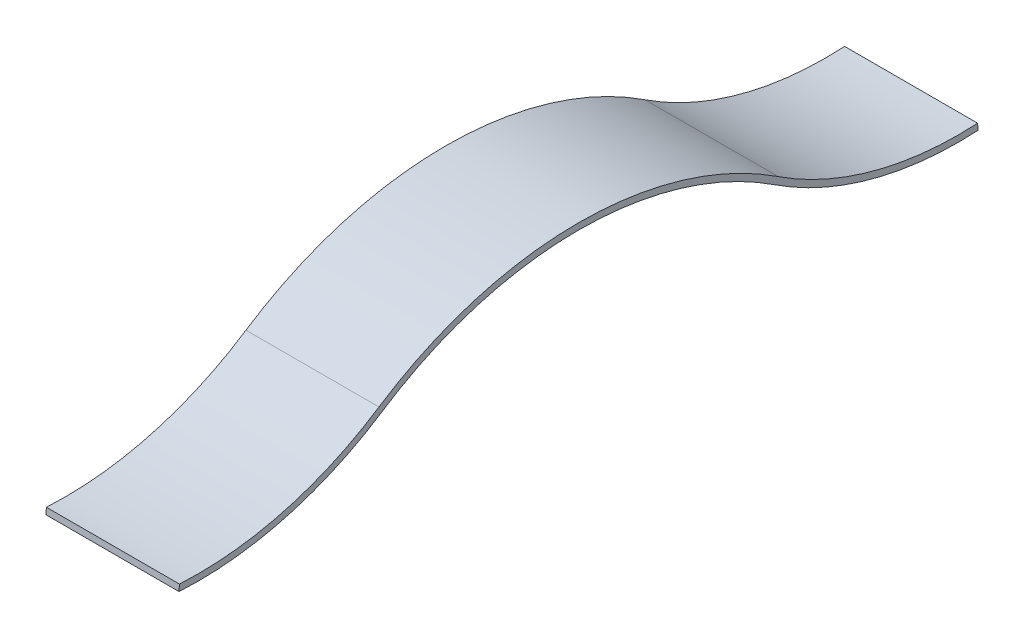
ISO-10303-21;
HEADER;
FILE_DESCRIPTION(('STEP AP214'),'2;1');
FILE_NAME('part.step','',(''),(''),'','','');
FILE_SCHEMA(('AUTOMOTIVE_DESIGN { 1 0 10303 214 1 1 1 1 }'));
ENDSEC;
DATA;
#1=APPLICATION_CONTEXT('core data for automotive mechanical design processes');
#2=APPLICATION_PROTOCOL_DEFINITION('international standard','automotive_design',2000,#1);
#3=PRODUCT_CONTEXT('',#1,'mechanical');
#4=PRODUCT('Part','Part','',(#3));
#5=PRODUCT_RELATED_PRODUCT_CATEGORY('part','',(#4));
#6=PRODUCT_DEFINITION_FORMATION('','',#4);
#7=PRODUCT_DEFINITION_CONTEXT('part definition',#1,'design');
#8=PRODUCT_DEFINITION('design','',#6,#7);
#9=PRODUCT_DEFINITION_SHAPE('','',#8);
#10=(LENGTH_UNIT() NAMED_UNIT(*) SI_UNIT(.MILLI.,.METRE.));
#11=(NAMED_UNIT(*) PLANE_ANGLE_UNIT() SI_UNIT($,.RADIAN.));
#12=(NAMED_UNIT(*) SI_UNIT($,.STERADIAN.) SOLID_ANGLE_UNIT());
#13=UNCERTAINTY_MEASURE_WITH_UNIT(LENGTH_MEASURE(1.E-05),#10,'distance_accuracy_value','');
#14=(GEOMETRIC_REPRESENTATION_CONTEXT(3) GLOBAL_UNCERTAINTY_ASSIGNED_CONTEXT((#13)) GLOBAL_UNIT_ASSIGNED_CONTEXT((#10,
#11,#12)) REPRESENTATION_CONTEXT('',''));
#15=CARTESIAN_POINT('',(0.,0.,0.));
#16=DIRECTION('',(0.,0.,1.));
#17=DIRECTION('',(1.,0.,0.));
#18=AXIS2_PLACEMENT_3D('',#15,#16,#17);
#19=CARTESIAN_POINT('',(3.175,15.9547447763906,-18.1447132798003));
#20=DIRECTION('',(-1.,0.,0.));
#21=DIRECTION('',(0.,0.,1.));
#22=AXIS2_PLACEMENT_3D('',#19,#20,#21);
#23=CYLINDRICAL_SURFACE('',#22,15.9809065175587);
#24=CARTESIAN_POINT('',(-3.175,15.9547447763906,-18.1447132798003));
#25=DIRECTION('',(1.,0.,0.));
#26=DIRECTION('',(0.,0.,-1.));
#27=AXIS2_PLACEMENT_3D('',#24,#25,#26);
#28=CIRCLE('',#27,15.9809065175587);
#29=CARTESIAN_POINT('',(-3.175,2.60661630936149,-9.35740199871795));
#30=VERTEX_POINT('',#29);
#31=CARTESIAN_POINT('',(-3.175,0.000508678522886941,-19.0676020360673));
#32=VERTEX_POINT('',#31);
#33=EDGE_CURVE('E147',#30,#32,#28,.T.);
#34=ORIENTED_EDGE('',*,*,#33,.T.);
#35=DIRECTION('',(-1.,0.,0.));
#36=VECTOR('',#35,1.);
#37=CARTESIAN_POINT('',(3.175,0.000508678522886941,-19.0676020360673));
#38=LINE('',#37,#36);
#39=CARTESIAN_POINT('',(3.175,0.000508678522886941,-19.0676020360673));
#40=VERTEX_POINT('',#39);
#41=EDGE_CURVE('E11',#40,#32,#38,.T.);
#42=ORIENTED_EDGE('',*,*,#41,.F.);
#43=CARTESIAN_POINT('',(3.175,15.9547447763906,-18.1447132798003));
#44=DIRECTION('',(1.,0.,0.));
#45=DIRECTION('',(0.,0.,-1.));
#46=AXIS2_PLACEMENT_3D('',#43,#44,#45);
#47=CIRCLE('',#46,15.9809065175587);
#48=CARTESIAN_POINT('',(3.175,2.60661630936149,-9.35740199871795));
#49=VERTEX_POINT('',#48);
#50=EDGE_CURVE('E99',#49,#40,#47,.T.);
#51=ORIENTED_EDGE('',*,*,#50,.F.);
#52=DIRECTION('',(-1.,0.,0.));
#53=VECTOR('',#52,1.);
#54=CARTESIAN_POINT('',(3.175,2.60661630936149,-9.35740199871795));
#55=LINE('',#54,#53);
#56=EDGE_CURVE('E146',#49,#30,#55,.T.);
#57=ORIENTED_EDGE('',*,*,#56,.T.);
#58=EDGE_LOOP('',(#34,#42,#51,#57));
#59=FACE_BOUND('',#58,.T.);
#60=ADVANCED_FACE('F43',(#59),#23,.T.);
#61=CARTESIAN_POINT('',(3.175,0.304799999999997,-19.05));
#62=DIRECTION('',(0.,0.0577494621630589,-0.998331107208364));
#63=DIRECTION('',(0.,0.998331107208364,0.0577494621630589));
#64=AXIS2_PLACEMENT_3D('',#61,#62,#63);
#65=PLANE('',#64);
#66=DIRECTION('',(0.,-0.998331107208364,-0.0577494621630589));
#67=VECTOR('',#66,1.);
#68=CARTESIAN_POINT('',(-3.175,0.304799999999997,-19.05));
#69=LINE('',#68,#67);
#70=CARTESIAN_POINT('',(-3.175,0.304799999999997,-19.05));
#71=VERTEX_POINT('',#70);
#72=EDGE_CURVE('E151',#71,#32,#69,.T.);
#73=ORIENTED_EDGE('',*,*,#72,.F.);
#74=DIRECTION('',(-1.,0.,0.));
#75=VECTOR('',#74,1.);
#76=CARTESIAN_POINT('',(3.175,0.304799999999997,-19.05));
#77=LINE('',#76,#75);
#78=CARTESIAN_POINT('',(3.175,0.304799999999997,-19.05));
#79=VERTEX_POINT('',#78);
#80=EDGE_CURVE('E52',#79,#71,#77,.T.);
#81=ORIENTED_EDGE('',*,*,#80,.F.);
#82=DIRECTION('',(0.,-0.998331107208364,-0.0577494621630589));
#83=VECTOR('',#82,1.);
#84=CARTESIAN_POINT('',(3.175,0.304799999999997,-19.05));
#85=LINE('',#84,#83);
#86=EDGE_CURVE('E204',#79,#40,#85,.T.);
#87=ORIENTED_EDGE('',*,*,#86,.T.);
#88=ORIENTED_EDGE('',*,*,#41,.T.);
#89=EDGE_LOOP('',(#73,#81,#87,#88));
#90=FACE_BOUND('',#89,.T.);
#91=ADVANCED_FACE('F195',(#90),#65,.T.);
#92=CARTESIAN_POINT('',(3.175,15.9547447763906,-18.1447132798003));
#93=DIRECTION('',(-1.,0.,0.));
#94=DIRECTION('',(0.,0.,1.));
#95=AXIS2_PLACEMENT_3D('',#92,#93,#94);
#96=CYLINDRICAL_SURFACE('',#95,15.6761065175587);
#97=CARTESIAN_POINT('',(-3.175,15.9547447763906,-18.1447132798003));
#98=DIRECTION('',(1.,0.,0.));
#99=DIRECTION('',(0.,0.,-1.));
#100=AXIS2_PLACEMENT_3D('',#97,#98,#99);
#101=CIRCLE('',#100,15.6761065175587);
#102=CARTESIAN_POINT('',(-3.175,2.8612019645795,-9.52500028080107));
#103=VERTEX_POINT('',#102);
#104=EDGE_CURVE('E155',#103,#71,#101,.T.);
#105=ORIENTED_EDGE('',*,*,#104,.F.);
#106=DIRECTION('',(-1.,0.,0.));
#107=VECTOR('',#106,1.);
#108=CARTESIAN_POINT('',(3.175,2.8612019645795,-9.52500028080107));
#109=LINE('',#108,#107);
#110=CARTESIAN_POINT('',(3.175,2.8612019645795,-9.52500028080107));
#111=VERTEX_POINT('',#110);
#112=EDGE_CURVE('E182',#111,#103,#109,.T.);
#113=ORIENTED_EDGE('',*,*,#112,.F.);
#114=CARTESIAN_POINT('',(3.175,15.9547447763906,-18.1447132798003));
#115=DIRECTION('',(1.,0.,0.));
#116=DIRECTION('',(0.,0.,-1.));
#117=AXIS2_PLACEMENT_3D('',#114,#115,#116);
#118=CIRCLE('',#117,15.6761065175587);
#119=EDGE_CURVE('E192',#111,#79,#118,.T.);
#120=ORIENTED_EDGE('',*,*,#119,.T.);
#121=ORIENTED_EDGE('',*,*,#80,.T.);
#122=EDGE_LOOP('',(#105,#113,#120,#121));
#123=FACE_BOUND('',#122,.T.);
#124=ADVANCED_FACE('F190',(#123),#96,.F.);
#125=CARTESIAN_POINT('',(3.175,-11.607493103767,0.));
#126=DIRECTION('',(-1.,0.,0.));
#127=DIRECTION('',(0.,0.,1.));
#128=AXIS2_PLACEMENT_3D('',#125,#126,#127);
#129=CYLINDRICAL_SURFACE('',#128,17.322493103767);
#130=CARTESIAN_POINT('',(-3.175,-11.607493103767,0.));
#131=DIRECTION('',(-1.,0.,0.));
#132=DIRECTION('',(0.,0.,1.));
#133=AXIS2_PLACEMENT_3D('',#130,#131,#132);
#134=CIRCLE('',#133,17.322493103767);
#135=CARTESIAN_POINT('',(-3.175,2.8612019645795,9.52500028080108));
#136=VERTEX_POINT('',#135);
#137=EDGE_CURVE('E159',#136,#103,#134,.T.);
#138=ORIENTED_EDGE('',*,*,#137,.F.);
#139=DIRECTION('',(-1.,0.,0.));
#140=VECTOR('',#139,1.);
#141=CARTESIAN_POINT('',(3.175,2.8612019645795,9.52500028080108));
#142=LINE('',#141,#140);
#143=CARTESIAN_POINT('',(3.175,2.8612019645795,9.52500028080108));
#144=VERTEX_POINT('',#143);
#145=EDGE_CURVE('E179',#144,#136,#142,.T.);
#146=ORIENTED_EDGE('',*,*,#145,.F.);
#147=CARTESIAN_POINT('',(3.175,-11.607493103767,0.));
#148=DIRECTION('',(-1.,0.,0.));
#149=DIRECTION('',(0.,0.,1.));
#150=AXIS2_PLACEMENT_3D('',#147,#148,#149);
#151=CIRCLE('',#150,17.322493103767);
#152=EDGE_CURVE('E140',#144,#111,#151,.T.);
#153=ORIENTED_EDGE('',*,*,#152,.T.);
#154=ORIENTED_EDGE('',*,*,#112,.T.);
#155=EDGE_LOOP('',(#138,#146,#153,#154));
#156=FACE_BOUND('',#155,.T.);
#157=ADVANCED_FACE('F202',(#156),#129,.T.);
#158=CARTESIAN_POINT('',(3.175,15.9547447763906,18.1447132798002));
#159=DIRECTION('',(-1.,0.,0.));
#160=DIRECTION('',(0.,0.,1.));
#161=AXIS2_PLACEMENT_3D('',#158,#159,#160);
#162=CYLINDRICAL_SURFACE('',#161,15.6761065175586);
#163=CARTESIAN_POINT('',(-3.175,15.9547447763906,18.1447132798002));
#164=DIRECTION('',(1.,0.,0.));
#165=DIRECTION('',(0.,0.,-1.));
#166=AXIS2_PLACEMENT_3D('',#163,#164,#165);
#167=CIRCLE('',#166,15.6761065175586);
#168=CARTESIAN_POINT('',(-3.175,0.304799999999997,19.05));
#169=VERTEX_POINT('',#168);
#170=EDGE_CURVE('E163',#169,#136,#167,.T.);
#171=ORIENTED_EDGE('',*,*,#170,.F.);
#172=DIRECTION('',(-1.,0.,0.));
#173=VECTOR('',#172,1.);
#174=CARTESIAN_POINT('',(3.175,0.304799999999997,19.05));
#175=LINE('',#174,#173);
#176=CARTESIAN_POINT('',(3.175,0.304799999999997,19.05));
#177=VERTEX_POINT('',#176);
#178=EDGE_CURVE('E124',#177,#169,#175,.T.);
#179=ORIENTED_EDGE('',*,*,#178,.F.);
#180=CARTESIAN_POINT('',(3.175,15.9547447763906,18.1447132798002));
#181=DIRECTION('',(1.,0.,0.));
#182=DIRECTION('',(0.,0.,-1.));
#183=AXIS2_PLACEMENT_3D('',#180,#181,#182);
#184=CIRCLE('',#183,15.6761065175586);
#185=EDGE_CURVE('E135',#177,#144,#184,.T.);
#186=ORIENTED_EDGE('',*,*,#185,.T.);
#187=ORIENTED_EDGE('',*,*,#145,.T.);
#188=EDGE_LOOP('',(#171,#179,#186,#187));
#189=FACE_BOUND('',#188,.T.);
#190=ADVANCED_FACE('F226',(#189),#162,.F.);
#191=CARTESIAN_POINT('',(3.175,0.000508678522886941,19.0676020360673));
#192=DIRECTION('',(0.,0.0577494621630476,0.998331107208364));
#193=DIRECTION('',(0.,-0.998331107208364,0.0577494621630476));
#194=AXIS2_PLACEMENT_3D('',#191,#192,#193);
#195=PLANE('',#194);
#196=DIRECTION('',(0.,0.998331107208364,-0.0577494621630476));
#197=VECTOR('',#196,1.);
#198=CARTESIAN_POINT('',(-3.175,0.000508678522886941,19.0676020360673));
#199=LINE('',#198,#197);
#200=CARTESIAN_POINT('',(-3.175,0.000508678522886941,19.0676020360673));
#201=VERTEX_POINT('',#200);
#202=EDGE_CURVE('E122',#201,#169,#199,.T.);
#203=ORIENTED_EDGE('',*,*,#202,.F.);
#204=DIRECTION('',(-1.,0.,0.));
#205=VECTOR('',#204,1.);
#206=CARTESIAN_POINT('',(3.175,0.000508678522886941,19.0676020360673));
#207=LINE('',#206,#205);
#208=CARTESIAN_POINT('',(3.175,0.000508678522886941,19.0676020360673));
#209=VERTEX_POINT('',#208);
#210=EDGE_CURVE('E116',#209,#201,#207,.T.);
#211=ORIENTED_EDGE('',*,*,#210,.F.);
#212=DIRECTION('',(0.,0.998331107208364,-0.0577494621630476));
#213=VECTOR('',#212,1.);
#214=CARTESIAN_POINT('',(3.175,0.000508678522886941,19.0676020360673));
#215=LINE('',#214,#213);
#216=EDGE_CURVE('E120',#209,#177,#215,.T.);
#217=ORIENTED_EDGE('',*,*,#216,.T.);
#218=ORIENTED_EDGE('',*,*,#178,.T.);
#219=EDGE_LOOP('',(#203,#211,#217,#218));
#220=FACE_BOUND('',#219,.T.);
#221=ADVANCED_FACE('F118',(#220),#195,.T.);
#222=CARTESIAN_POINT('',(3.175,15.9547447763906,18.1447132798002));
#223=DIRECTION('',(-1.,0.,0.));
#224=DIRECTION('',(0.,0.,1.));
#225=AXIS2_PLACEMENT_3D('',#222,#223,#224);
#226=CYLINDRICAL_SURFACE('',#225,15.9809065175586);
#227=CARTESIAN_POINT('',(-3.175,15.9547447763906,18.1447132798002));
#228=DIRECTION('',(1.,0.,0.));
#229=DIRECTION('',(0.,0.,-1.));
#230=AXIS2_PLACEMENT_3D('',#227,#228,#229);
#231=CIRCLE('',#230,15.9809065175586);
#232=CARTESIAN_POINT('',(-3.175,2.60661630936149,9.35740199871795));
#233=VERTEX_POINT('',#232);
#234=EDGE_CURVE('E87',#201,#233,#231,.T.);
#235=ORIENTED_EDGE('',*,*,#234,.T.);
#236=DIRECTION('',(-1.,0.,0.));
#237=VECTOR('',#236,1.);
#238=CARTESIAN_POINT('',(3.175,2.60661630936149,9.35740199871795));
#239=LINE('',#238,#237);
#240=CARTESIAN_POINT('',(3.175,2.60661630936149,9.35740199871795));
#241=VERTEX_POINT('',#240);
#242=EDGE_CURVE('E125',#241,#233,#239,.T.);
#243=ORIENTED_EDGE('',*,*,#242,.F.);
#244=CARTESIAN_POINT('',(3.175,15.9547447763906,18.1447132798002));
#245=DIRECTION('',(1.,0.,0.));
#246=DIRECTION('',(0.,0.,-1.));
#247=AXIS2_PLACEMENT_3D('',#244,#245,#246);
#248=CIRCLE('',#247,15.9809065175586);
#249=EDGE_CURVE('E127',#209,#241,#248,.T.);
#250=ORIENTED_EDGE('',*,*,#249,.F.);
#251=ORIENTED_EDGE('',*,*,#210,.T.);
#252=EDGE_LOOP('',(#235,#243,#250,#251));
#253=FACE_BOUND('',#252,.T.);
#254=ADVANCED_FACE('F128',(#253),#226,.T.);
#255=CARTESIAN_POINT('',(3.175,-11.607493103767,0.));
#256=DIRECTION('',(-1.,0.,0.));
#257=DIRECTION('',(0.,0.,1.));
#258=AXIS2_PLACEMENT_3D('',#255,#256,#257);
#259=CYLINDRICAL_SURFACE('',#258,17.017693103767);
#260=CARTESIAN_POINT('',(-3.175,-11.607493103767,0.));
#261=DIRECTION('',(1.,0.,0.));
#262=DIRECTION('',(0.,0.,-1.));
#263=AXIS2_PLACEMENT_3D('',#260,#261,#262);
#264=CIRCLE('',#263,17.017693103767);
#265=EDGE_CURVE('E93',#233,#30,#264,.F.);
#266=ORIENTED_EDGE('',*,*,#265,.T.);
#267=ORIENTED_EDGE('',*,*,#56,.F.);
#268=CARTESIAN_POINT('',(3.175,-11.607493103767,0.));
#269=DIRECTION('',(1.,0.,0.));
#270=DIRECTION('',(0.,0.,-1.));
#271=AXIS2_PLACEMENT_3D('',#268,#269,#270);
#272=CIRCLE('',#271,17.017693103767);
#273=EDGE_CURVE('E60',#241,#49,#272,.F.);
#274=ORIENTED_EDGE('',*,*,#273,.F.);
#275=ORIENTED_EDGE('',*,*,#242,.T.);
#276=EDGE_LOOP('',(#266,#267,#274,#275));
#277=FACE_BOUND('',#276,.T.);
#278=ADVANCED_FACE('F228',(#277),#259,.F.);
#279=CARTESIAN_POINT('',(3.175,15.9547447763906,-18.1447132798003));
#280=DIRECTION('',(1.,0.,0.));
#281=DIRECTION('',(0.,0.,-1.));
#282=AXIS2_PLACEMENT_3D('',#279,#280,#281);
#283=PLANE('',#282);
#284=ORIENTED_EDGE('',*,*,#50,.T.);
#285=ORIENTED_EDGE('',*,*,#86,.F.);
#286=ORIENTED_EDGE('',*,*,#119,.F.);
#287=ORIENTED_EDGE('',*,*,#152,.F.);
#288=ORIENTED_EDGE('',*,*,#185,.F.);
#289=ORIENTED_EDGE('',*,*,#216,.F.);
#290=ORIENTED_EDGE('',*,*,#249,.T.);
#291=ORIENTED_EDGE('',*,*,#273,.T.);
#292=EDGE_LOOP('',(#284,#285,#286,#287,#288,#289,#290,#291));
#293=FACE_BOUND('',#292,.T.);
#294=ADVANCED_FACE('F132',(#293),#283,.T.);
#295=CARTESIAN_POINT('',(-3.175,15.9547447763906,-18.1447132798003));
#296=DIRECTION('',(1.,0.,0.));
#297=DIRECTION('',(0.,0.,-1.));
#298=AXIS2_PLACEMENT_3D('',#295,#296,#297);
#299=PLANE('',#298);
#300=ORIENTED_EDGE('',*,*,#33,.F.);
#301=ORIENTED_EDGE('',*,*,#265,.F.);
#302=ORIENTED_EDGE('',*,*,#234,.F.);
#303=ORIENTED_EDGE('',*,*,#202,.T.);
#304=ORIENTED_EDGE('',*,*,#170,.T.);
#305=ORIENTED_EDGE('',*,*,#137,.T.);
#306=ORIENTED_EDGE('',*,*,#104,.T.);
#307=ORIENTED_EDGE('',*,*,#72,.T.);
#308=EDGE_LOOP('',(#300,#301,#302,#303,#304,#305,#306,#307));
#309=FACE_BOUND('',#308,.T.);
#310=ADVANCED_FACE('F198',(#309),#299,.F.);
#311=CLOSED_SHELL('',(#60,#91,#124,#157,#190,#221,#254,#278,#294,#310));
#312=MANIFOLD_SOLID_BREP('B2',#311);
#313=ADVANCED_BREP_SHAPE_REPRESENTATION('',(#18,#312),#14);
#314=SHAPE_DEFINITION_REPRESENTATION(#9,#313);
ENDSEC;
END-ISO-10303-21;
